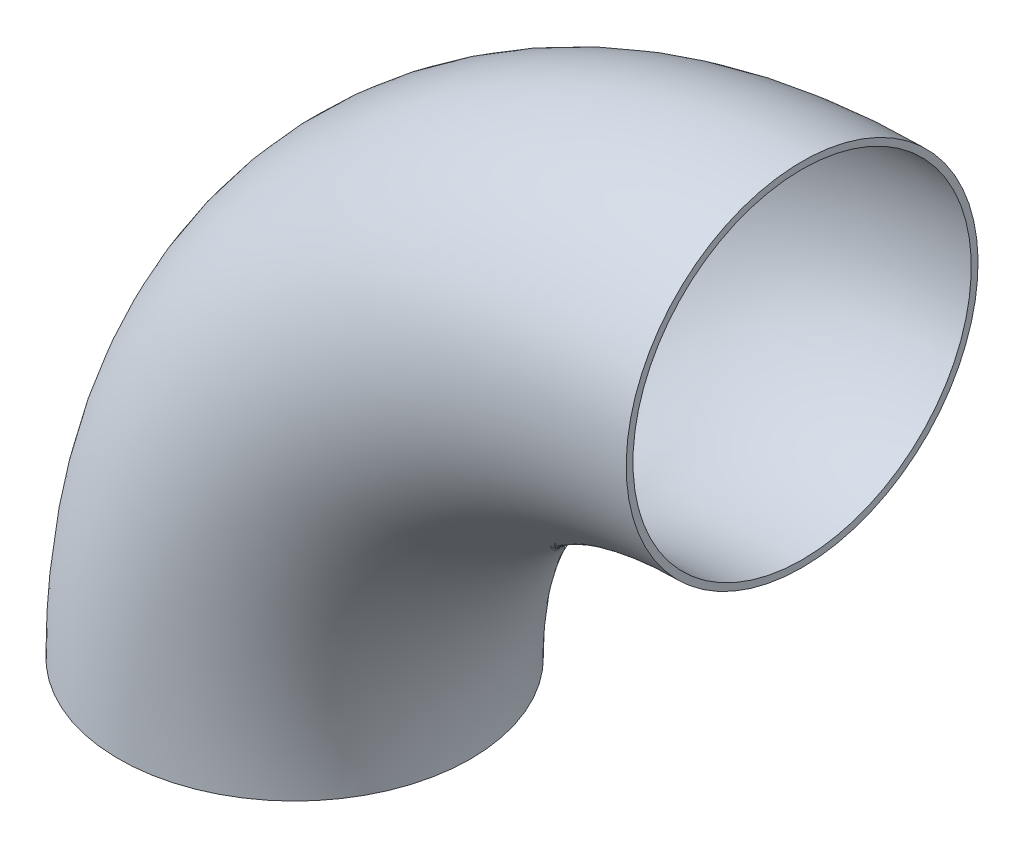
ISO-10303-21;
HEADER;
FILE_DESCRIPTION(('STEP AP214'),'2;1');
FILE_NAME('part.step','',(''),(''),'','','');
FILE_SCHEMA(('AUTOMOTIVE_DESIGN { 1 0 10303 214 1 1 1 1 }'));
ENDSEC;
DATA;
#1=APPLICATION_CONTEXT('core data for automotive mechanical design processes');
#2=APPLICATION_PROTOCOL_DEFINITION('international standard','automotive_design',2000,#1);
#3=PRODUCT_CONTEXT('',#1,'mechanical');
#4=PRODUCT('Part','Part','',(#3));
#5=PRODUCT_RELATED_PRODUCT_CATEGORY('part','',(#4));
#6=PRODUCT_DEFINITION_FORMATION('','',#4);
#7=PRODUCT_DEFINITION_CONTEXT('part definition',#1,'design');
#8=PRODUCT_DEFINITION('design','',#6,#7);
#9=PRODUCT_DEFINITION_SHAPE('','',#8);
#10=(LENGTH_UNIT() NAMED_UNIT(*) SI_UNIT(.MILLI.,.METRE.));
#11=(NAMED_UNIT(*) PLANE_ANGLE_UNIT() SI_UNIT($,.RADIAN.));
#12=(NAMED_UNIT(*) SI_UNIT($,.STERADIAN.) SOLID_ANGLE_UNIT());
#13=UNCERTAINTY_MEASURE_WITH_UNIT(LENGTH_MEASURE(1.E-05),#10,'distance_accuracy_value','');
#14=(GEOMETRIC_REPRESENTATION_CONTEXT(3) GLOBAL_UNCERTAINTY_ASSIGNED_CONTEXT((#13)) GLOBAL_UNIT_ASSIGNED_CONTEXT((#10,
#11,#12)) REPRESENTATION_CONTEXT('',''));
#15=CARTESIAN_POINT('',(0.,0.,0.));
#16=DIRECTION('',(0.,0.,1.));
#17=DIRECTION('',(1.,0.,0.));
#18=AXIS2_PLACEMENT_3D('',#15,#16,#17);
#19=CARTESIAN_POINT('',(150.,145.361853832442,0.));
#20=DIRECTION('',(1.,0.,0.));
#21=DIRECTION('',(0.,0.,-1.));
#22=AXIS2_PLACEMENT_3D('',#19,#20,#21);
#23=PLANE('',#22);
#24=CARTESIAN_POINT('',(150.,150.,0.));
#25=DIRECTION('',(1.,0.,0.));
#26=DIRECTION('',(0.,-1.,0.));
#27=AXIS2_PLACEMENT_3D('',#24,#25,#26);
#28=CIRCLE('',#27,50.);
#29=CARTESIAN_POINT('',(150.,100.,0.));
#30=VERTEX_POINT('',#29);
#31=EDGE_CURVE('E22',#30,#30,#28,.T.);
#32=ORIENTED_EDGE('',*,*,#31,.F.);
#33=EDGE_LOOP('',(#32));
#34=FACE_BOUND('',#33,.T.);
#35=CARTESIAN_POINT('',(150.,150.,0.));
#36=DIRECTION('',(1.,0.,0.));
#37=DIRECTION('',(0.,-1.,0.));
#38=AXIS2_PLACEMENT_3D('',#35,#36,#37);
#39=CIRCLE('',#38,52.);
#40=CARTESIAN_POINT('',(150.,98.,0.));
#41=VERTEX_POINT('',#40);
#42=EDGE_CURVE('E9',#41,#41,#39,.T.);
#43=ORIENTED_EDGE('',*,*,#42,.T.);
#44=EDGE_LOOP('',(#43));
#45=FACE_BOUND('',#44,.T.);
#46=ADVANCED_FACE('F13',(#34,#45),#23,.T.);
#47=CARTESIAN_POINT('',(4.63814616755792,0.,0.));
#48=DIRECTION('',(0.,-1.,0.));
#49=DIRECTION('',(0.,0.,-1.));
#50=AXIS2_PLACEMENT_3D('',#47,#48,#49);
#51=PLANE('',#50);
#52=CARTESIAN_POINT('',(0.,0.,0.));
#53=DIRECTION('',(0.,-1.,0.));
#54=DIRECTION('',(1.,0.,0.));
#55=AXIS2_PLACEMENT_3D('',#52,#53,#54);
#56=CIRCLE('',#55,50.);
#57=CARTESIAN_POINT('',(50.,0.,0.));
#58=VERTEX_POINT('',#57);
#59=EDGE_CURVE('E37',#58,#58,#56,.T.);
#60=ORIENTED_EDGE('',*,*,#59,.F.);
#61=EDGE_LOOP('',(#60));
#62=FACE_BOUND('',#61,.T.);
#63=CARTESIAN_POINT('',(0.,0.,0.));
#64=DIRECTION('',(0.,1.,0.));
#65=DIRECTION('',(1.,0.,0.));
#66=AXIS2_PLACEMENT_3D('',#63,#64,#65);
#67=CIRCLE('',#66,52.);
#68=CARTESIAN_POINT('',(52.,0.,0.));
#69=VERTEX_POINT('',#68);
#70=EDGE_CURVE('E31',#69,#69,#67,.T.);
#71=ORIENTED_EDGE('',*,*,#70,.F.);
#72=EDGE_LOOP('',(#71));
#73=FACE_BOUND('',#72,.T.);
#74=ADVANCED_FACE('F43',(#62,#73),#51,.T.);
#75=CARTESIAN_POINT('',(150.,0.,0.));
#76=DIRECTION('',(0.,0.,1.));
#77=DIRECTION('',(1.,0.,0.));
#78=AXIS2_PLACEMENT_3D('',#75,#76,#77);
#79=TOROIDAL_SURFACE('',#78,150.,50.);
#80=ORIENTED_EDGE('',*,*,#59,.T.);
#81=EDGE_LOOP('',(#80));
#82=FACE_BOUND('',#81,.T.);
#83=ORIENTED_EDGE('',*,*,#31,.T.);
#84=EDGE_LOOP('',(#83));
#85=FACE_BOUND('',#84,.T.);
#86=ADVANCED_FACE('F40',(#82,#85),#79,.F.);
#87=CARTESIAN_POINT('',(150.,0.,0.));
#88=DIRECTION('',(0.,0.,1.));
#89=DIRECTION('',(1.,0.,0.));
#90=AXIS2_PLACEMENT_3D('',#87,#88,#89);
#91=TOROIDAL_SURFACE('',#90,150.,52.);
#92=ORIENTED_EDGE('',*,*,#42,.F.);
#93=EDGE_LOOP('',(#92));
#94=FACE_BOUND('',#93,.T.);
#95=ORIENTED_EDGE('',*,*,#70,.T.);
#96=EDGE_LOOP('',(#95));
#97=FACE_BOUND('',#96,.T.);
#98=ADVANCED_FACE('F15',(#94,#97),#91,.T.);
#99=CLOSED_SHELL('',(#46,#74,#86,#98));
#100=MANIFOLD_SOLID_BREP('B1',#99);
#101=ADVANCED_BREP_SHAPE_REPRESENTATION('',(#18,#100),#14);
#102=SHAPE_DEFINITION_REPRESENTATION(#9,#101);
ENDSEC;
END-ISO-10303-21;
